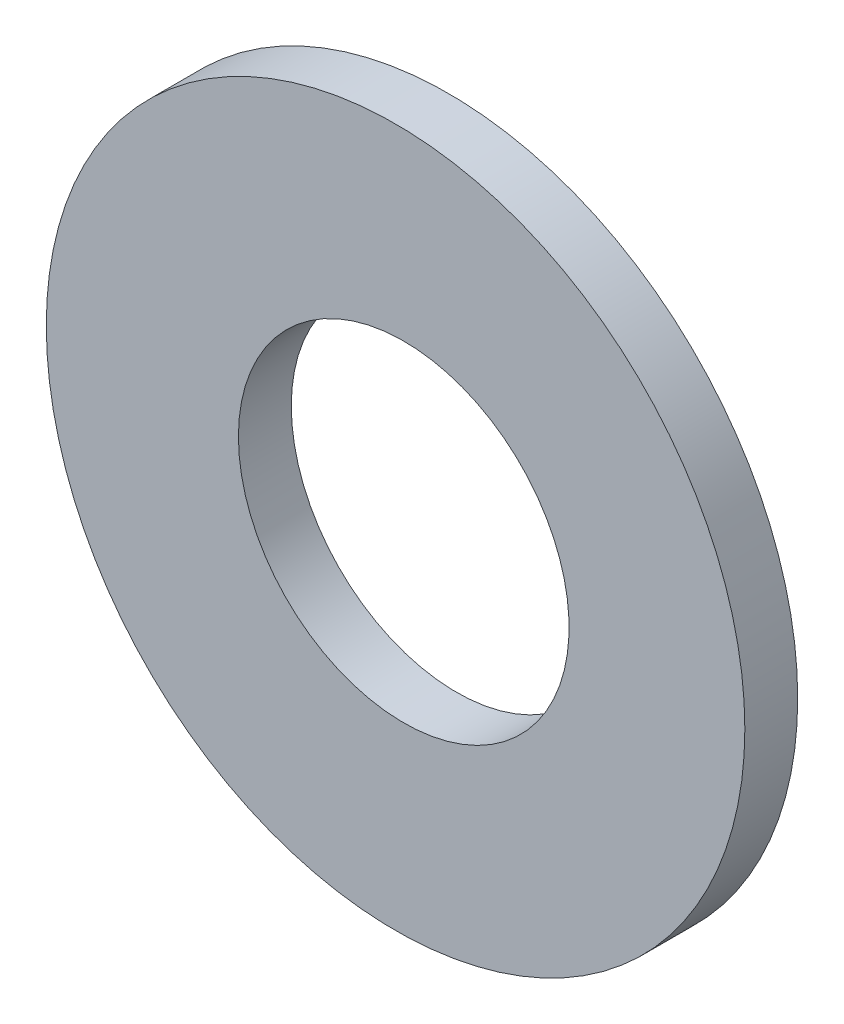
ISO-10303-21;
HEADER;
FILE_DESCRIPTION(('STEP AP214'),'2;1');
FILE_NAME('part.step','',(''),(''),'','','');
FILE_SCHEMA(('AUTOMOTIVE_DESIGN { 1 0 10303 214 1 1 1 1 }'));
ENDSEC;
DATA;
#1=APPLICATION_CONTEXT('core data for automotive mechanical design processes');
#2=APPLICATION_PROTOCOL_DEFINITION('international standard','automotive_design',2000,#1);
#3=PRODUCT_CONTEXT('',#1,'mechanical');
#4=PRODUCT('Part','Part','',(#3));
#5=PRODUCT_RELATED_PRODUCT_CATEGORY('part','',(#4));
#6=PRODUCT_DEFINITION_FORMATION('','',#4);
#7=PRODUCT_DEFINITION_CONTEXT('part definition',#1,'design');
#8=PRODUCT_DEFINITION('design','',#6,#7);
#9=PRODUCT_DEFINITION_SHAPE('','',#8);
#10=(LENGTH_UNIT() NAMED_UNIT(*) SI_UNIT(.MILLI.,.METRE.));
#11=(NAMED_UNIT(*) PLANE_ANGLE_UNIT() SI_UNIT($,.RADIAN.));
#12=(NAMED_UNIT(*) SI_UNIT($,.STERADIAN.) SOLID_ANGLE_UNIT());
#13=UNCERTAINTY_MEASURE_WITH_UNIT(LENGTH_MEASURE(1.E-05),#10,'distance_accuracy_value','');
#14=(GEOMETRIC_REPRESENTATION_CONTEXT(3) GLOBAL_UNCERTAINTY_ASSIGNED_CONTEXT((#13)) GLOBAL_UNIT_ASSIGNED_CONTEXT((#10,
#11,#12)) REPRESENTATION_CONTEXT('',''));
#15=CARTESIAN_POINT('',(0.,0.,0.));
#16=DIRECTION('',(0.,0.,1.));
#17=DIRECTION('',(1.,0.,0.));
#18=AXIS2_PLACEMENT_3D('',#15,#16,#17);
#19=CARTESIAN_POINT('',(0.,0.,12.79));
#20=DIRECTION('',(0.,0.,1.));
#21=DIRECTION('',(1.,0.,0.));
#22=AXIS2_PLACEMENT_3D('',#19,#20,#21);
#23=PLANE('',#22);
#24=CARTESIAN_POINT('',(0.,0.,12.79));
#25=DIRECTION('',(0.,0.,1.));
#26=DIRECTION('',(1.,0.,0.));
#27=AXIS2_PLACEMENT_3D('',#24,#25,#26);
#28=CIRCLE('',#27,84.5);
#29=CARTESIAN_POINT('',(84.5,0.,12.79));
#30=VERTEX_POINT('',#29);
#31=EDGE_CURVE('E27',#30,#30,#28,.F.);
#32=ORIENTED_EDGE('',*,*,#31,.F.);
#33=EDGE_LOOP('',(#32));
#34=FACE_BOUND('',#33,.T.);
#35=CARTESIAN_POINT('',(1.9775228574872,0.,12.79));
#36=DIRECTION('',(0.,0.,-1.));
#37=DIRECTION('',(-1.,0.,0.));
#38=AXIS2_PLACEMENT_3D('',#35,#36,#37);
#39=CIRCLE('',#38,40.);
#40=CARTESIAN_POINT('',(-38.0224771425128,0.,12.79));
#41=VERTEX_POINT('',#40);
#42=EDGE_CURVE('E18',#41,#41,#39,.T.);
#43=ORIENTED_EDGE('',*,*,#42,.T.);
#44=EDGE_LOOP('',(#43));
#45=FACE_BOUND('',#44,.T.);
#46=ADVANCED_FACE('F15',(#34,#45),#23,.T.);
#47=CARTESIAN_POINT('',(1.9775228574872,0.,-226.564070534451));
#48=DIRECTION('',(0.,0.,-1.));
#49=DIRECTION('',(-1.,0.,0.));
#50=AXIS2_PLACEMENT_3D('',#47,#48,#49);
#51=CYLINDRICAL_SURFACE('',#50,40.);
#52=CARTESIAN_POINT('',(1.9775228574872,0.,0.));
#53=DIRECTION('',(0.,0.,-1.));
#54=DIRECTION('',(-1.,0.,0.));
#55=AXIS2_PLACEMENT_3D('',#52,#53,#54);
#56=CIRCLE('',#55,40.);
#57=CARTESIAN_POINT('',(-38.0224771425128,0.,0.));
#58=VERTEX_POINT('',#57);
#59=EDGE_CURVE('E22',#58,#58,#56,.T.);
#60=ORIENTED_EDGE('',*,*,#59,.T.);
#61=EDGE_LOOP('',(#60));
#62=FACE_BOUND('',#61,.T.);
#63=ORIENTED_EDGE('',*,*,#42,.F.);
#64=EDGE_LOOP('',(#63));
#65=FACE_BOUND('',#64,.T.);
#66=ADVANCED_FACE('F36',(#62,#65),#51,.F.);
#67=CARTESIAN_POINT('',(0.,0.,12.79));
#68=DIRECTION('',(0.,0.,1.));
#69=DIRECTION('',(1.,0.,0.));
#70=AXIS2_PLACEMENT_3D('',#67,#68,#69);
#71=CYLINDRICAL_SURFACE('',#70,84.5);
#72=CARTESIAN_POINT('',(0.,0.,0.));
#73=DIRECTION('',(0.,0.,1.));
#74=DIRECTION('',(1.,0.,0.));
#75=AXIS2_PLACEMENT_3D('',#72,#73,#74);
#76=CIRCLE('',#75,84.5);
#77=CARTESIAN_POINT('',(84.5,0.,0.));
#78=VERTEX_POINT('',#77);
#79=EDGE_CURVE('E10',#78,#78,#76,.T.);
#80=ORIENTED_EDGE('',*,*,#79,.T.);
#81=EDGE_LOOP('',(#80));
#82=FACE_BOUND('',#81,.T.);
#83=ORIENTED_EDGE('',*,*,#31,.T.);
#84=EDGE_LOOP('',(#83));
#85=FACE_BOUND('',#84,.T.);
#86=ADVANCED_FACE('F38',(#82,#85),#71,.T.);
#87=CARTESIAN_POINT('',(0.,0.,0.));
#88=DIRECTION('',(0.,0.,1.));
#89=DIRECTION('',(1.,0.,0.));
#90=AXIS2_PLACEMENT_3D('',#87,#88,#89);
#91=PLANE('',#90);
#92=ORIENTED_EDGE('',*,*,#79,.F.);
#93=EDGE_LOOP('',(#92));
#94=FACE_BOUND('',#93,.T.);
#95=ORIENTED_EDGE('',*,*,#59,.F.);
#96=EDGE_LOOP('',(#95));
#97=FACE_BOUND('',#96,.T.);
#98=ADVANCED_FACE('F45',(#94,#97),#91,.F.);
#99=CLOSED_SHELL('',(#46,#66,#86,#98));
#100=MANIFOLD_SOLID_BREP('B1',#99);
#101=ADVANCED_BREP_SHAPE_REPRESENTATION('',(#18,#100),#14);
#102=SHAPE_DEFINITION_REPRESENTATION(#9,#101);
ENDSEC;
END-ISO-10303-21;
